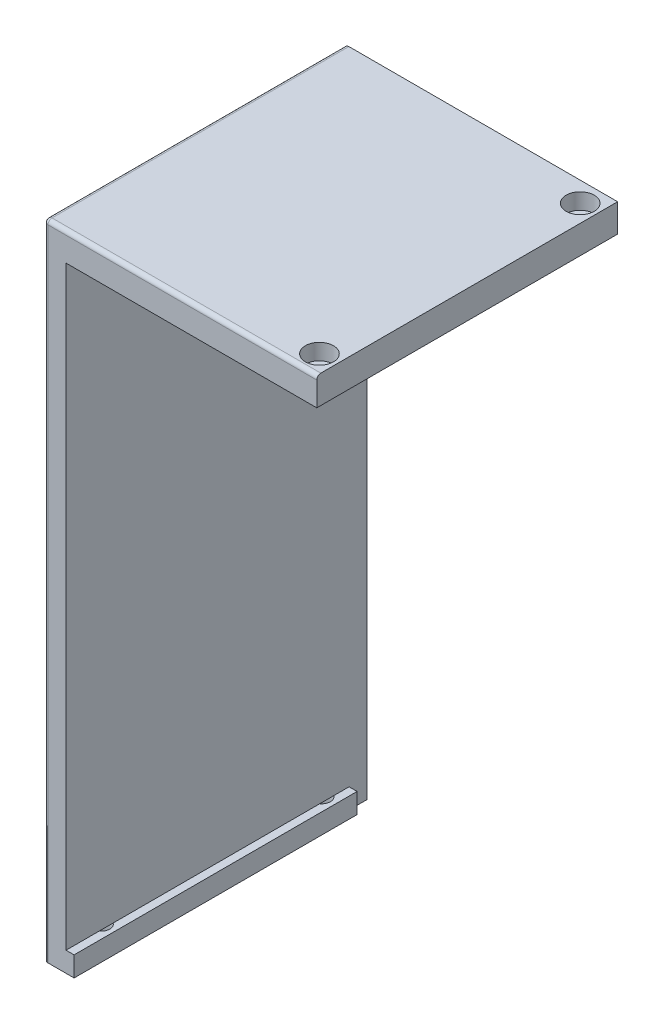
ISO-10303-21;
HEADER;
FILE_DESCRIPTION(('STEP AP214'),'2;1');
FILE_NAME('part.step','',(''),(''),'','','');
FILE_SCHEMA(('AUTOMOTIVE_DESIGN { 1 0 10303 214 1 1 1 1 }'));
ENDSEC;
DATA;
#1=APPLICATION_CONTEXT('core data for automotive mechanical design processes');
#2=APPLICATION_PROTOCOL_DEFINITION('international standard','automotive_design',2000,#1);
#3=PRODUCT_CONTEXT('',#1,'mechanical');
#4=PRODUCT('Part','Part','',(#3));
#5=PRODUCT_RELATED_PRODUCT_CATEGORY('part','',(#4));
#6=PRODUCT_DEFINITION_FORMATION('','',#4);
#7=PRODUCT_DEFINITION_CONTEXT('part definition',#1,'design');
#8=PRODUCT_DEFINITION('design','',#6,#7);
#9=PRODUCT_DEFINITION_SHAPE('','',#8);
#10=(LENGTH_UNIT() NAMED_UNIT(*) SI_UNIT(.MILLI.,.METRE.));
#11=(NAMED_UNIT(*) PLANE_ANGLE_UNIT() SI_UNIT($,.RADIAN.));
#12=(NAMED_UNIT(*) SI_UNIT($,.STERADIAN.) SOLID_ANGLE_UNIT());
#13=UNCERTAINTY_MEASURE_WITH_UNIT(LENGTH_MEASURE(1.E-05),#10,'distance_accuracy_value','');
#14=(GEOMETRIC_REPRESENTATION_CONTEXT(3) GLOBAL_UNCERTAINTY_ASSIGNED_CONTEXT((#13)) GLOBAL_UNIT_ASSIGNED_CONTEXT((#10,
#11,#12)) REPRESENTATION_CONTEXT('',''));
#15=CARTESIAN_POINT('',(0.,0.,0.));
#16=DIRECTION('',(0.,0.,1.));
#17=DIRECTION('',(1.,0.,0.));
#18=AXIS2_PLACEMENT_3D('',#15,#16,#17);
#19=CARTESIAN_POINT('',(-88.5,-160.346147871578,249.169133709891));
#20=DIRECTION('',(-1.,0.,0.));
#21=DIRECTION('',(0.,-1.,0.));
#22=AXIS2_PLACEMENT_3D('',#19,#20,#21);
#23=PLANE('',#22);
#24=DIRECTION('',(0.,1.,0.));
#25=VECTOR('',#24,1.);
#26=CARTESIAN_POINT('',(-88.5,-160.346147871578,4.44806923152896));
#27=LINE('',#26,#25);
#28=CARTESIAN_POINT('',(-88.5,-160.346147871578,4.44806923152896));
#29=VERTEX_POINT('',#28);
#30=CARTESIAN_POINT('',(-88.5,-155.346147871578,4.44806923152896));
#31=VERTEX_POINT('',#30);
#32=EDGE_CURVE('E177',#29,#31,#27,.T.);
#33=ORIENTED_EDGE('',*,*,#32,.F.);
#34=DIRECTION('',(0.,0.,-1.));
#35=VECTOR('',#34,1.);
#36=CARTESIAN_POINT('',(-88.5,-160.346147871578,249.169133709891));
#37=LINE('',#36,#35);
#38=CARTESIAN_POINT('',(-88.5,-160.346147871578,0.));
#39=VERTEX_POINT('',#38);
#40=EDGE_CURVE('E222',#29,#39,#37,.T.);
#41=ORIENTED_EDGE('',*,*,#40,.T.);
#42=DIRECTION('',(0.,1.,0.));
#43=VECTOR('',#42,1.);
#44=CARTESIAN_POINT('',(-88.5,-160.346147871578,0.));
#45=LINE('',#44,#43);
#46=CARTESIAN_POINT('',(-88.5,-7.00000000000011,0.));
#47=VERTEX_POINT('',#46);
#48=EDGE_CURVE('E233',#39,#47,#45,.T.);
#49=ORIENTED_EDGE('',*,*,#48,.T.);
#50=DIRECTION('',(0.,0.,-1.));
#51=VECTOR('',#50,1.);
#52=CARTESIAN_POINT('',(-88.5,-7.00000000000011,249.169133709891));
#53=LINE('',#52,#51);
#54=CARTESIAN_POINT('',(-88.5,-7.00000000000011,75.0000000000001));
#55=VERTEX_POINT('',#54);
#56=EDGE_CURVE('E264',#55,#47,#53,.T.);
#57=ORIENTED_EDGE('',*,*,#56,.F.);
#58=DIRECTION('',(0.,-1.,0.));
#59=VECTOR('',#58,1.);
#60=CARTESIAN_POINT('',(-88.5,-160.346147871578,75.0000000000001));
#61=LINE('',#60,#59);
#62=CARTESIAN_POINT('',(-88.5,-155.346147871578,75.0000000000001));
#63=VERTEX_POINT('',#62);
#64=EDGE_CURVE('E223',#55,#63,#61,.T.);
#65=ORIENTED_EDGE('',*,*,#64,.T.);
#66=DIRECTION('',(0.,0.,1.));
#67=VECTOR('',#66,1.);
#68=CARTESIAN_POINT('',(-88.5,-155.346147871578,75.0000000000001));
#69=LINE('',#68,#67);
#70=CARTESIAN_POINT('',(-88.5,-155.346147871578,66.7492855684538));
#71=VERTEX_POINT('',#70);
#72=EDGE_CURVE('E166',#71,#63,#69,.T.);
#73=ORIENTED_EDGE('',*,*,#72,.F.);
#74=CARTESIAN_POINT('',(-88.5,-155.346147871578,63.2507144315466));
#75=VERTEX_POINT('',#74);
#76=EDGE_CURVE('E158',#75,#71,#69,.T.);
#77=ORIENTED_EDGE('',*,*,#76,.F.);
#78=CARTESIAN_POINT('',(-88.5,-155.346147871578,11.7492855684538));
#79=VERTEX_POINT('',#78);
#80=EDGE_CURVE('E168',#79,#75,#69,.T.);
#81=ORIENTED_EDGE('',*,*,#80,.F.);
#82=CARTESIAN_POINT('',(-88.5,-155.346147871578,8.2507144315466));
#83=VERTEX_POINT('',#82);
#84=EDGE_CURVE('E173',#83,#79,#69,.T.);
#85=ORIENTED_EDGE('',*,*,#84,.F.);
#86=EDGE_CURVE('E174',#31,#83,#69,.T.);
#87=ORIENTED_EDGE('',*,*,#86,.F.);
#88=EDGE_LOOP('',(#33,#41,#49,#57,#65,#73,#77,#81,#85,#87));
#89=FACE_BOUND('',#88,.T.);
#90=ADVANCED_FACE('F44',(#89),#23,.F.);
#91=CARTESIAN_POINT('',(-30.3417133767425,-160.347147871578,70.0000000000001));
#92=DIRECTION('',(0.,1.,0.));
#93=DIRECTION('',(0.,0.,1.));
#94=AXIS2_PLACEMENT_3D('',#91,#92,#93);
#95=CYLINDRICAL_SURFACE('',#94,2.05);
#96=CARTESIAN_POINT('',(-30.3417133767425,-7.00000000000012,70.0000000000001));
#97=DIRECTION('',(0.,1.,0.));
#98=DIRECTION('',(-1.,0.,0.));
#99=AXIS2_PLACEMENT_3D('',#96,#97,#98);
#100=CIRCLE('',#99,2.05);
#101=CARTESIAN_POINT('',(-32.3917133767425,-7.00000000000012,70.0000000000001));
#102=VERTEX_POINT('',#101);
#103=EDGE_CURVE('E200',#102,#102,#100,.F.);
#104=ORIENTED_EDGE('',*,*,#103,.T.);
#105=EDGE_LOOP('',(#104));
#106=FACE_BOUND('',#105,.T.);
#107=CARTESIAN_POINT('',(-30.3417133767425,-4.,70.0000000000001));
#108=DIRECTION('',(0.,1.,0.));
#109=DIRECTION('',(0.,0.,1.));
#110=AXIS2_PLACEMENT_3D('',#107,#108,#109);
#111=CIRCLE('',#110,2.05);
#112=CARTESIAN_POINT('',(-30.3417133767425,-4.,72.0500000000001));
#113=VERTEX_POINT('',#112);
#114=EDGE_CURVE('E194',#113,#113,#111,.T.);
#115=ORIENTED_EDGE('',*,*,#114,.T.);
#116=EDGE_LOOP('',(#115));
#117=FACE_BOUND('',#116,.T.);
#118=ADVANCED_FACE('F375',(#106,#117),#95,.F.);
#119=CARTESIAN_POINT('',(-30.3417133767425,-160.347147871578,5.0000000000001));
#120=DIRECTION('',(0.,1.,0.));
#121=DIRECTION('',(0.,0.,1.));
#122=AXIS2_PLACEMENT_3D('',#119,#120,#121);
#123=CYLINDRICAL_SURFACE('',#122,2.05);
#124=CARTESIAN_POINT('',(-30.3417133767425,-7.00000000000012,5.0000000000001));
#125=DIRECTION('',(0.,1.,0.));
#126=DIRECTION('',(-1.,0.,0.));
#127=AXIS2_PLACEMENT_3D('',#124,#125,#126);
#128=CIRCLE('',#127,2.05);
#129=CARTESIAN_POINT('',(-32.3917133767425,-7.00000000000012,5.0000000000001));
#130=VERTEX_POINT('',#129);
#131=EDGE_CURVE('E214',#130,#130,#128,.F.);
#132=ORIENTED_EDGE('',*,*,#131,.T.);
#133=EDGE_LOOP('',(#132));
#134=FACE_BOUND('',#133,.T.);
#135=CARTESIAN_POINT('',(-30.3417133767425,-4.,5.0000000000001));
#136=DIRECTION('',(0.,1.,0.));
#137=DIRECTION('',(0.,0.,1.));
#138=AXIS2_PLACEMENT_3D('',#135,#136,#137);
#139=CIRCLE('',#138,2.05);
#140=CARTESIAN_POINT('',(-30.3417133767425,-4.,7.0500000000001));
#141=VERTEX_POINT('',#140);
#142=EDGE_CURVE('E191',#141,#141,#139,.T.);
#143=ORIENTED_EDGE('',*,*,#142,.T.);
#144=EDGE_LOOP('',(#143));
#145=FACE_BOUND('',#144,.T.);
#146=ADVANCED_FACE('F376',(#134,#145),#123,.F.);
#147=CARTESIAN_POINT('',(-93.,-1.00000000000022,0.));
#148=DIRECTION('',(0.,0.,1.));
#149=DIRECTION('',(1.,0.,0.));
#150=AXIS2_PLACEMENT_3D('',#147,#148,#149);
#151=PLANE('',#150);
#152=DIRECTION('',(1.,0.,0.));
#153=VECTOR('',#152,1.);
#154=CARTESIAN_POINT('',(-88.5,-160.346147871578,0.));
#155=LINE('',#154,#153);
#156=CARTESIAN_POINT('',(-94.,-160.346147871578,0.));
#157=VERTEX_POINT('',#156);
#158=EDGE_CURVE('E213',#157,#39,#155,.T.);
#159=ORIENTED_EDGE('',*,*,#158,.F.);
#160=DIRECTION('',(0.,-1.,0.));
#161=VECTOR('',#160,1.);
#162=CARTESIAN_POINT('',(-94.,-160.346147871578,0.));
#163=LINE('',#162,#161);
#164=CARTESIAN_POINT('',(-94.,-1.00000000000022,0.));
#165=VERTEX_POINT('',#164);
#166=EDGE_CURVE('E250',#165,#157,#163,.T.);
#167=ORIENTED_EDGE('',*,*,#166,.F.);
#168=CARTESIAN_POINT('',(-93.,-1.00000000000022,0.));
#169=DIRECTION('',(0.,0.,1.));
#170=DIRECTION('',(1.,0.,0.));
#171=AXIS2_PLACEMENT_3D('',#168,#169,#170);
#172=CIRCLE('',#171,1.);
#173=CARTESIAN_POINT('',(-93.,-2.2227497988864E-13,0.));
#174=VERTEX_POINT('',#173);
#175=EDGE_CURVE('E242',#174,#165,#172,.T.);
#176=ORIENTED_EDGE('',*,*,#175,.F.);
#177=DIRECTION('',(-1.,0.,0.));
#178=VECTOR('',#177,1.);
#179=CARTESIAN_POINT('',(-26.,-1.11252677426124E-13,0.));
#180=LINE('',#179,#178);
#181=CARTESIAN_POINT('',(-26.,-1.11252677426124E-13,0.));
#182=VERTEX_POINT('',#181);
#183=EDGE_CURVE('E241',#182,#174,#180,.T.);
#184=ORIENTED_EDGE('',*,*,#183,.F.);
#185=DIRECTION('',(0.,1.,0.));
#186=VECTOR('',#185,1.);
#187=CARTESIAN_POINT('',(-26.,-7.00000000000012,0.));
#188=LINE('',#187,#186);
#189=CARTESIAN_POINT('',(-26.,-7.00000000000012,0.));
#190=VERTEX_POINT('',#189);
#191=EDGE_CURVE('E238',#190,#182,#188,.T.);
#192=ORIENTED_EDGE('',*,*,#191,.F.);
#193=DIRECTION('',(1.,0.,0.));
#194=VECTOR('',#193,1.);
#195=CARTESIAN_POINT('',(-88.5,-7.00000000000011,0.));
#196=LINE('',#195,#194);
#197=EDGE_CURVE('E232',#47,#190,#196,.T.);
#198=ORIENTED_EDGE('',*,*,#197,.F.);
#199=ORIENTED_EDGE('',*,*,#48,.F.);
#200=EDGE_LOOP('',(#159,#167,#176,#184,#192,#198,#199));
#201=FACE_BOUND('',#200,.T.);
#202=ADVANCED_FACE('F345',(#201),#151,.F.);
#203=CARTESIAN_POINT('',(-94.,-160.346147871578,249.169133709891));
#204=DIRECTION('',(1.,0.,0.));
#205=DIRECTION('',(0.,0.,-1.));
#206=AXIS2_PLACEMENT_3D('',#203,#204,#205);
#207=PLANE('',#206);
#208=DIRECTION('',(0.,0.,-1.));
#209=VECTOR('',#208,1.);
#210=CARTESIAN_POINT('',(-94.,-160.346147871578,249.169133709891));
#211=LINE('',#210,#209);
#212=CARTESIAN_POINT('',(-94.,-160.346147871578,74.0000000000001));
#213=VERTEX_POINT('',#212);
#214=EDGE_CURVE('E252',#213,#157,#211,.T.);
#215=ORIENTED_EDGE('',*,*,#214,.F.);
#216=DIRECTION('',(0.,1.,0.));
#217=VECTOR('',#216,1.);
#218=CARTESIAN_POINT('',(-94.,-160.346147871578,74.0000000000001));
#219=LINE('',#218,#217);
#220=CARTESIAN_POINT('',(-94.,-1.00000000000022,74.0000000000001));
#221=VERTEX_POINT('',#220);
#222=EDGE_CURVE('E53',#213,#221,#219,.T.);
#223=ORIENTED_EDGE('',*,*,#222,.T.);
#224=DIRECTION('',(0.,0.,-1.));
#225=VECTOR('',#224,1.);
#226=CARTESIAN_POINT('',(-94.,-1.00000000000022,249.169133709891));
#227=LINE('',#226,#225);
#228=EDGE_CURVE('E254',#221,#165,#227,.T.);
#229=ORIENTED_EDGE('',*,*,#228,.T.);
#230=ORIENTED_EDGE('',*,*,#166,.T.);
#231=EDGE_LOOP('',(#215,#223,#229,#230));
#232=FACE_BOUND('',#231,.T.);
#233=ADVANCED_FACE('F338',(#232),#207,.F.);
#234=CARTESIAN_POINT('',(-93.,-1.00000000000022,249.169133709891));
#235=DIRECTION('',(0.,0.,-1.));
#236=DIRECTION('',(-1.,0.,0.));
#237=AXIS2_PLACEMENT_3D('',#234,#235,#236);
#238=CYLINDRICAL_SURFACE('',#237,1.);
#239=ORIENTED_EDGE('',*,*,#228,.F.);
#240=CARTESIAN_POINT('',(-93.,-1.00000000000022,74.0000000000001));
#241=DIRECTION('',(0.,0.,-1.));
#242=DIRECTION('',(-1.,0.,0.));
#243=AXIS2_PLACEMENT_3D('',#240,#241,#242);
#244=CIRCLE('',#243,1.);
#245=CARTESIAN_POINT('',(-93.,-2.2227497988864E-13,74.0000000000001));
#246=VERTEX_POINT('',#245);
#247=EDGE_CURVE('E277',#221,#246,#244,.T.);
#248=ORIENTED_EDGE('',*,*,#247,.T.);
#249=DIRECTION('',(0.,0.,-1.));
#250=VECTOR('',#249,1.);
#251=CARTESIAN_POINT('',(-93.,-2.2227497988864E-13,249.169133709891));
#252=LINE('',#251,#250);
#253=EDGE_CURVE('E253',#246,#174,#252,.T.);
#254=ORIENTED_EDGE('',*,*,#253,.T.);
#255=ORIENTED_EDGE('',*,*,#175,.T.);
#256=EDGE_LOOP('',(#239,#248,#254,#255));
#257=FACE_BOUND('',#256,.T.);
#258=ADVANCED_FACE('F336',(#257),#238,.T.);
#259=CARTESIAN_POINT('',(-26.,-1.11252677426124E-13,249.169133709891));
#260=DIRECTION('',(0.,-1.,0.));
#261=DIRECTION('',(1.,0.,0.));
#262=AXIS2_PLACEMENT_3D('',#259,#260,#261);
#263=PLANE('',#262);
#264=CARTESIAN_POINT('',(-30.3417133767425,0.,5.0000000000001));
#265=DIRECTION('',(0.,1.,0.));
#266=DIRECTION('',(0.,0.,1.));
#267=AXIS2_PLACEMENT_3D('',#264,#265,#266);
#268=CIRCLE('',#267,3.5);
#269=CARTESIAN_POINT('',(-30.3417133767425,0.,8.5000000000001));
#270=VERTEX_POINT('',#269);
#271=EDGE_CURVE('E192',#270,#270,#268,.T.);
#272=ORIENTED_EDGE('',*,*,#271,.F.);
#273=EDGE_LOOP('',(#272));
#274=FACE_BOUND('',#273,.T.);
#275=CARTESIAN_POINT('',(-30.3417133767425,0.,70.0000000000001));
#276=DIRECTION('',(0.,1.,0.));
#277=DIRECTION('',(0.,0.,1.));
#278=AXIS2_PLACEMENT_3D('',#275,#276,#277);
#279=CIRCLE('',#278,3.5);
#280=CARTESIAN_POINT('',(-30.3417133767425,0.,73.5000000000001));
#281=VERTEX_POINT('',#280);
#282=EDGE_CURVE('E203',#281,#281,#279,.T.);
#283=ORIENTED_EDGE('',*,*,#282,.F.);
#284=EDGE_LOOP('',(#283));
#285=FACE_BOUND('',#284,.T.);
#286=ORIENTED_EDGE('',*,*,#253,.F.);
#287=DIRECTION('',(1.,0.,0.));
#288=VECTOR('',#287,1.);
#289=CARTESIAN_POINT('',(-26.,-1.11252677426124E-13,74.0000000000001));
#290=LINE('',#289,#288);
#291=CARTESIAN_POINT('',(-26.,-1.11252677426124E-13,74.0000000000001));
#292=VERTEX_POINT('',#291);
#293=EDGE_CURVE('E270',#246,#292,#290,.T.);
#294=ORIENTED_EDGE('',*,*,#293,.T.);
#295=DIRECTION('',(0.,0.,-1.));
#296=VECTOR('',#295,1.);
#297=CARTESIAN_POINT('',(-26.,-1.11252677426124E-13,249.169133709891));
#298=LINE('',#297,#296);
#299=EDGE_CURVE('E256',#292,#182,#298,.T.);
#300=ORIENTED_EDGE('',*,*,#299,.T.);
#301=ORIENTED_EDGE('',*,*,#183,.T.);
#302=EDGE_LOOP('',(#286,#294,#300,#301));
#303=FACE_BOUND('',#302,.T.);
#304=ADVANCED_FACE('F333',(#274,#285,#303),#263,.F.);
#305=CARTESIAN_POINT('',(-26.,-7.00000000000012,249.169133709891));
#306=DIRECTION('',(-1.,0.,0.));
#307=DIRECTION('',(0.,0.,1.));
#308=AXIS2_PLACEMENT_3D('',#305,#306,#307);
#309=PLANE('',#308);
#310=ORIENTED_EDGE('',*,*,#299,.F.);
#311=CARTESIAN_POINT('',(-26.,-1.00000000000011,74.0000000000001));
#312=DIRECTION('',(-1.,0.,0.));
#313=DIRECTION('',(0.,0.,1.));
#314=AXIS2_PLACEMENT_3D('',#311,#312,#313);
#315=CIRCLE('',#314,1.);
#316=CARTESIAN_POINT('',(-26.,-1.00000000000011,75.0000000000001));
#317=VERTEX_POINT('',#316);
#318=EDGE_CURVE('E272',#292,#317,#315,.F.);
#319=ORIENTED_EDGE('',*,*,#318,.T.);
#320=DIRECTION('',(0.,-1.,0.));
#321=VECTOR('',#320,1.);
#322=CARTESIAN_POINT('',(-26.,-7.00000000000011,75.0000000000001));
#323=LINE('',#322,#321);
#324=CARTESIAN_POINT('',(-26.,-7.00000000000012,75.0000000000001));
#325=VERTEX_POINT('',#324);
#326=EDGE_CURVE('E217',#317,#325,#323,.T.);
#327=ORIENTED_EDGE('',*,*,#326,.T.);
#328=DIRECTION('',(0.,0.,-1.));
#329=VECTOR('',#328,1.);
#330=CARTESIAN_POINT('',(-26.,-7.00000000000012,249.169133709891));
#331=LINE('',#330,#329);
#332=EDGE_CURVE('E257',#325,#190,#331,.T.);
#333=ORIENTED_EDGE('',*,*,#332,.T.);
#334=ORIENTED_EDGE('',*,*,#191,.T.);
#335=EDGE_LOOP('',(#310,#319,#327,#333,#334));
#336=FACE_BOUND('',#335,.T.);
#337=ADVANCED_FACE('F330',(#336),#309,.F.);
#338=CARTESIAN_POINT('',(-88.5,-7.00000000000011,249.169133709891));
#339=DIRECTION('',(0.,1.,0.));
#340=DIRECTION('',(-1.,0.,0.));
#341=AXIS2_PLACEMENT_3D('',#338,#339,#340);
#342=PLANE('',#341);
#343=ORIENTED_EDGE('',*,*,#131,.F.);
#344=EDGE_LOOP('',(#343));
#345=FACE_BOUND('',#344,.T.);
#346=ORIENTED_EDGE('',*,*,#103,.F.);
#347=EDGE_LOOP('',(#346));
#348=FACE_BOUND('',#347,.T.);
#349=ORIENTED_EDGE('',*,*,#332,.F.);
#350=DIRECTION('',(-1.,0.,0.));
#351=VECTOR('',#350,1.);
#352=CARTESIAN_POINT('',(-88.5,-7.00000000000011,75.0000000000001));
#353=LINE('',#352,#351);
#354=EDGE_CURVE('E220',#325,#55,#353,.T.);
#355=ORIENTED_EDGE('',*,*,#354,.T.);
#356=ORIENTED_EDGE('',*,*,#56,.T.);
#357=ORIENTED_EDGE('',*,*,#197,.T.);
#358=EDGE_LOOP('',(#349,#355,#356,#357));
#359=FACE_BOUND('',#358,.T.);
#360=ADVANCED_FACE('F326',(#345,#348,#359),#342,.F.);
#361=CARTESIAN_POINT('',(-88.5,-160.346147871578,249.169133709891));
#362=DIRECTION('',(0.,1.,0.));
#363=DIRECTION('',(0.,0.,1.));
#364=AXIS2_PLACEMENT_3D('',#361,#362,#363);
#365=PLANE('',#364);
#366=CARTESIAN_POINT('',(-89.75,-160.346147871578,10.0000000000002));
#367=DIRECTION('',(0.,-1.,0.));
#368=DIRECTION('',(0.,0.,-1.));
#369=AXIS2_PLACEMENT_3D('',#366,#367,#368);
#370=CIRCLE('',#369,2.15);
#371=CARTESIAN_POINT('',(-89.75,-160.346147871578,7.85000000000018));
#372=VERTEX_POINT('',#371);
#373=EDGE_CURVE('E342',#372,#372,#370,.T.);
#374=ORIENTED_EDGE('',*,*,#373,.F.);
#375=EDGE_LOOP('',(#374));
#376=FACE_BOUND('',#375,.T.);
#377=CARTESIAN_POINT('',(-89.75,-160.346147871578,65.0000000000002));
#378=DIRECTION('',(0.,-1.,0.));
#379=DIRECTION('',(0.,0.,-1.));
#380=AXIS2_PLACEMENT_3D('',#377,#378,#379);
#381=CIRCLE('',#380,2.15);
#382=CARTESIAN_POINT('',(-89.75,-160.346147871578,62.8500000000002));
#383=VERTEX_POINT('',#382);
#384=EDGE_CURVE('E163',#383,#383,#381,.T.);
#385=ORIENTED_EDGE('',*,*,#384,.F.);
#386=EDGE_LOOP('',(#385));
#387=FACE_BOUND('',#386,.T.);
#388=DIRECTION('',(-1.,0.,0.));
#389=VECTOR('',#388,1.);
#390=CARTESIAN_POINT('',(-88.5,-160.346147871578,75.0000000000001));
#391=LINE('',#390,#389);
#392=CARTESIAN_POINT('',(-86.5,-160.346147871578,75.0000000000001));
#393=VERTEX_POINT('',#392);
#394=CARTESIAN_POINT('',(-93.,-160.346147871578,75.0000000000001));
#395=VERTEX_POINT('',#394);
#396=EDGE_CURVE('E155',#393,#395,#391,.T.);
#397=ORIENTED_EDGE('',*,*,#396,.T.);
#398=CARTESIAN_POINT('',(-93.,-160.346147871578,74.0000000000001));
#399=DIRECTION('',(0.,1.,0.));
#400=DIRECTION('',(0.,0.,1.));
#401=AXIS2_PLACEMENT_3D('',#398,#399,#400);
#402=CIRCLE('',#401,1.);
#403=EDGE_CURVE('E11',#395,#213,#402,.F.);
#404=ORIENTED_EDGE('',*,*,#403,.T.);
#405=ORIENTED_EDGE('',*,*,#214,.T.);
#406=ORIENTED_EDGE('',*,*,#158,.T.);
#407=ORIENTED_EDGE('',*,*,#40,.F.);
#408=DIRECTION('',(-1.,0.,0.));
#409=VECTOR('',#408,1.);
#410=CARTESIAN_POINT('',(-86.5,-160.346147871578,4.44806923152896));
#411=LINE('',#410,#409);
#412=CARTESIAN_POINT('',(-86.5,-160.346147871578,4.44806923152896));
#413=VERTEX_POINT('',#412);
#414=EDGE_CURVE('E189',#413,#29,#411,.T.);
#415=ORIENTED_EDGE('',*,*,#414,.F.);
#416=DIRECTION('',(0.,0.,-1.));
#417=VECTOR('',#416,1.);
#418=CARTESIAN_POINT('',(-86.5,-160.346147871578,75.0000000000001));
#419=LINE('',#418,#417);
#420=EDGE_CURVE('E303',#393,#413,#419,.T.);
#421=ORIENTED_EDGE('',*,*,#420,.F.);
#422=EDGE_LOOP('',(#397,#404,#405,#406,#407,#415,#421));
#423=FACE_BOUND('',#422,.T.);
#424=ADVANCED_FACE('F301',(#376,#387,#423),#365,.F.);
#425=CARTESIAN_POINT('',(-26.,-284.465111250859,75.0000000000001));
#426=DIRECTION('',(0.,0.,-1.));
#427=DIRECTION('',(0.,-1.,0.));
#428=AXIS2_PLACEMENT_3D('',#425,#426,#427);
#429=PLANE('',#428);
#430=ORIENTED_EDGE('',*,*,#326,.F.);
#431=DIRECTION('',(1.,0.,0.));
#432=VECTOR('',#431,1.);
#433=CARTESIAN_POINT('',(-26.0000000000005,-1.00000000000011,75.0000000000001));
#434=LINE('',#433,#432);
#435=CARTESIAN_POINT('',(-93.,-1.00000000000022,75.0000000000001));
#436=VERTEX_POINT('',#435);
#437=EDGE_CURVE('E276',#317,#436,#434,.F.);
#438=ORIENTED_EDGE('',*,*,#437,.T.);
#439=DIRECTION('',(0.,1.,0.));
#440=VECTOR('',#439,1.);
#441=CARTESIAN_POINT('',(-93.,-284.465111250859,75.0000000000001));
#442=LINE('',#441,#440);
#443=EDGE_CURVE('E274',#436,#395,#442,.F.);
#444=ORIENTED_EDGE('',*,*,#443,.T.);
#445=ORIENTED_EDGE('',*,*,#396,.F.);
#446=DIRECTION('',(0.,-1.,0.));
#447=VECTOR('',#446,1.);
#448=CARTESIAN_POINT('',(-86.5,-160.346147871578,75.0000000000001));
#449=LINE('',#448,#447);
#450=CARTESIAN_POINT('',(-86.5,-155.346147871578,75.0000000000001));
#451=VERTEX_POINT('',#450);
#452=EDGE_CURVE('E178',#451,#393,#449,.T.);
#453=ORIENTED_EDGE('',*,*,#452,.F.);
#454=DIRECTION('',(-1.,0.,0.));
#455=VECTOR('',#454,1.);
#456=CARTESIAN_POINT('',(-86.5,-155.346147871578,75.0000000000001));
#457=LINE('',#456,#455);
#458=EDGE_CURVE('E181',#451,#63,#457,.T.);
#459=ORIENTED_EDGE('',*,*,#458,.T.);
#460=ORIENTED_EDGE('',*,*,#64,.F.);
#461=ORIENTED_EDGE('',*,*,#354,.F.);
#462=EDGE_LOOP('',(#430,#438,#444,#445,#453,#459,#460,#461));
#463=FACE_BOUND('',#462,.T.);
#464=ADVANCED_FACE('F296',(#463),#429,.F.);
#465=CARTESIAN_POINT('',(-30.3417133767425,-4.,5.0000000000001));
#466=DIRECTION('',(0.,1.,0.));
#467=DIRECTION('',(0.,0.,1.));
#468=AXIS2_PLACEMENT_3D('',#465,#466,#467);
#469=CYLINDRICAL_SURFACE('',#468,3.5);
#470=CARTESIAN_POINT('',(-30.3417133767425,-4.,5.0000000000001));
#471=DIRECTION('',(0.,1.,0.));
#472=DIRECTION('',(0.,0.,1.));
#473=AXIS2_PLACEMENT_3D('',#470,#471,#472);
#474=CIRCLE('',#473,3.5);
#475=CARTESIAN_POINT('',(-30.3417133767425,-4.,8.5000000000001));
#476=VERTEX_POINT('',#475);
#477=EDGE_CURVE('E197',#476,#476,#474,.T.);
#478=ORIENTED_EDGE('',*,*,#477,.F.);
#479=EDGE_LOOP('',(#478));
#480=FACE_BOUND('',#479,.T.);
#481=ORIENTED_EDGE('',*,*,#271,.T.);
#482=EDGE_LOOP('',(#481));
#483=FACE_BOUND('',#482,.T.);
#484=ADVANCED_FACE('F364',(#480,#483),#469,.F.);
#485=CARTESIAN_POINT('',(-30.3417133767425,-4.,5.0000000000001));
#486=DIRECTION('',(0.,1.,0.));
#487=DIRECTION('',(0.,0.,1.));
#488=AXIS2_PLACEMENT_3D('',#485,#486,#487);
#489=PLANE('',#488);
#490=ORIENTED_EDGE('',*,*,#142,.F.);
#491=EDGE_LOOP('',(#490));
#492=FACE_BOUND('',#491,.T.);
#493=ORIENTED_EDGE('',*,*,#477,.T.);
#494=EDGE_LOOP('',(#493));
#495=FACE_BOUND('',#494,.T.);
#496=ADVANCED_FACE('F397',(#492,#495),#489,.T.);
#497=CARTESIAN_POINT('',(-30.3417133767425,-4.,70.0000000000001));
#498=DIRECTION('',(0.,1.,0.));
#499=DIRECTION('',(0.,0.,1.));
#500=AXIS2_PLACEMENT_3D('',#497,#498,#499);
#501=CYLINDRICAL_SURFACE('',#500,3.5);
#502=CARTESIAN_POINT('',(-30.3417133767425,-4.,70.0000000000001));
#503=DIRECTION('',(0.,1.,0.));
#504=DIRECTION('',(0.,0.,1.));
#505=AXIS2_PLACEMENT_3D('',#502,#503,#504);
#506=CIRCLE('',#505,3.5);
#507=CARTESIAN_POINT('',(-30.3417133767425,-4.,73.5000000000001));
#508=VERTEX_POINT('',#507);
#509=EDGE_CURVE('E196',#508,#508,#506,.T.);
#510=ORIENTED_EDGE('',*,*,#509,.F.);
#511=EDGE_LOOP('',(#510));
#512=FACE_BOUND('',#511,.T.);
#513=ORIENTED_EDGE('',*,*,#282,.T.);
#514=EDGE_LOOP('',(#513));
#515=FACE_BOUND('',#514,.T.);
#516=ADVANCED_FACE('F392',(#512,#515),#501,.F.);
#517=CARTESIAN_POINT('',(-30.3417133767425,-4.,70.0000000000001));
#518=DIRECTION('',(0.,1.,0.));
#519=DIRECTION('',(0.,0.,1.));
#520=AXIS2_PLACEMENT_3D('',#517,#518,#519);
#521=PLANE('',#520);
#522=ORIENTED_EDGE('',*,*,#114,.F.);
#523=EDGE_LOOP('',(#522));
#524=FACE_BOUND('',#523,.T.);
#525=ORIENTED_EDGE('',*,*,#509,.T.);
#526=EDGE_LOOP('',(#525));
#527=FACE_BOUND('',#526,.T.);
#528=ADVANCED_FACE('F395',(#524,#527),#521,.T.);
#529=CARTESIAN_POINT('',(-86.5,-160.346147871578,4.44806923152896));
#530=DIRECTION('',(0.,0.,1.));
#531=DIRECTION('',(1.,0.,0.));
#532=AXIS2_PLACEMENT_3D('',#529,#530,#531);
#533=PLANE('',#532);
#534=ORIENTED_EDGE('',*,*,#32,.T.);
#535=DIRECTION('',(-1.,0.,0.));
#536=VECTOR('',#535,1.);
#537=CARTESIAN_POINT('',(-86.5,-155.346147871578,4.44806923152896));
#538=LINE('',#537,#536);
#539=CARTESIAN_POINT('',(-86.5,-155.346147871578,4.44806923152896));
#540=VERTEX_POINT('',#539);
#541=EDGE_CURVE('E183',#540,#31,#538,.T.);
#542=ORIENTED_EDGE('',*,*,#541,.F.);
#543=DIRECTION('',(0.,1.,0.));
#544=VECTOR('',#543,1.);
#545=CARTESIAN_POINT('',(-86.5,-160.346147871578,4.44806923152896));
#546=LINE('',#545,#544);
#547=EDGE_CURVE('E308',#413,#540,#546,.T.);
#548=ORIENTED_EDGE('',*,*,#547,.F.);
#549=ORIENTED_EDGE('',*,*,#414,.T.);
#550=EDGE_LOOP('',(#534,#542,#548,#549));
#551=FACE_BOUND('',#550,.T.);
#552=ADVANCED_FACE('F316',(#551),#533,.F.);
#553=CARTESIAN_POINT('',(-86.5,-155.346147871578,75.0000000000001));
#554=DIRECTION('',(0.,-1.,0.));
#555=DIRECTION('',(1.,0.,0.));
#556=AXIS2_PLACEMENT_3D('',#553,#554,#555);
#557=PLANE('',#556);
#558=ORIENTED_EDGE('',*,*,#86,.T.);
#559=CARTESIAN_POINT('',(-89.75,-155.346147871578,10.0000000000002));
#560=DIRECTION('',(0.,-1.,0.));
#561=DIRECTION('',(1.,0.,0.));
#562=AXIS2_PLACEMENT_3D('',#559,#560,#561);
#563=CIRCLE('',#562,2.15);
#564=EDGE_CURVE('E153',#83,#79,#563,.T.);
#565=ORIENTED_EDGE('',*,*,#564,.T.);
#566=ORIENTED_EDGE('',*,*,#80,.T.);
#567=CARTESIAN_POINT('',(-89.75,-155.346147871578,65.0000000000002));
#568=DIRECTION('',(0.,-1.,0.));
#569=DIRECTION('',(1.,0.,0.));
#570=AXIS2_PLACEMENT_3D('',#567,#568,#569);
#571=CIRCLE('',#570,2.15);
#572=EDGE_CURVE('E143',#75,#71,#571,.T.);
#573=ORIENTED_EDGE('',*,*,#572,.T.);
#574=ORIENTED_EDGE('',*,*,#72,.T.);
#575=ORIENTED_EDGE('',*,*,#458,.F.);
#576=DIRECTION('',(0.,0.,1.));
#577=VECTOR('',#576,1.);
#578=CARTESIAN_POINT('',(-86.5,-155.346147871578,75.0000000000001));
#579=LINE('',#578,#577);
#580=EDGE_CURVE('E184',#540,#451,#579,.T.);
#581=ORIENTED_EDGE('',*,*,#580,.F.);
#582=ORIENTED_EDGE('',*,*,#541,.T.);
#583=EDGE_LOOP('',(#558,#565,#566,#573,#574,#575,#581,#582));
#584=FACE_BOUND('',#583,.T.);
#585=ADVANCED_FACE('F175',(#584),#557,.F.);
#586=CARTESIAN_POINT('',(-86.5,0.,0.));
#587=DIRECTION('',(-1.,0.,0.));
#588=DIRECTION('',(0.,0.,1.));
#589=AXIS2_PLACEMENT_3D('',#586,#587,#588);
#590=PLANE('',#589);
#591=ORIENTED_EDGE('',*,*,#452,.T.);
#592=ORIENTED_EDGE('',*,*,#420,.T.);
#593=ORIENTED_EDGE('',*,*,#547,.T.);
#594=ORIENTED_EDGE('',*,*,#580,.T.);
#595=EDGE_LOOP('',(#591,#592,#593,#594));
#596=FACE_BOUND('',#595,.T.);
#597=ADVANCED_FACE('F309',(#596),#590,.F.);
#598=CARTESIAN_POINT('',(-86.5,-155.346147871578,75.0000000000001));
#599=DIRECTION('',(0.,-1.,0.));
#600=DIRECTION('',(1.,0.,0.));
#601=AXIS2_PLACEMENT_3D('',#598,#599,#600);
#602=PLANE('',#601);
#603=ORIENTED_EDGE('',*,*,#76,.T.);
#604=CARTESIAN_POINT('',(-89.75,-155.346147871578,65.0000000000002));
#605=DIRECTION('',(0.,-1.,0.));
#606=DIRECTION('',(1.,0.,0.));
#607=AXIS2_PLACEMENT_3D('',#604,#605,#606);
#608=CIRCLE('',#607,2.15);
#609=EDGE_CURVE('E148',#75,#71,#608,.F.);
#610=ORIENTED_EDGE('',*,*,#609,.F.);
#611=EDGE_LOOP('',(#603,#610));
#612=FACE_BOUND('',#611,.T.);
#613=ADVANCED_FACE('F156',(#612),#602,.T.);
#614=CARTESIAN_POINT('',(-89.75,-149.265029553373,65.0000000000002));
#615=DIRECTION('',(0.,-1.,0.));
#616=DIRECTION('',(0.,0.,-1.));
#617=AXIS2_PLACEMENT_3D('',#614,#615,#616);
#618=CYLINDRICAL_SURFACE('',#617,2.15);
#619=ORIENTED_EDGE('',*,*,#609,.T.);
#620=ORIENTED_EDGE('',*,*,#572,.F.);
#621=EDGE_LOOP('',(#619,#620));
#622=FACE_BOUND('',#621,.T.);
#623=ORIENTED_EDGE('',*,*,#384,.T.);
#624=EDGE_LOOP('',(#623));
#625=FACE_BOUND('',#624,.T.);
#626=ADVANCED_FACE('F146',(#622,#625),#618,.F.);
#627=CARTESIAN_POINT('',(-86.5,-155.346147871578,75.0000000000001));
#628=DIRECTION('',(0.,-1.,0.));
#629=DIRECTION('',(1.,0.,0.));
#630=AXIS2_PLACEMENT_3D('',#627,#628,#629);
#631=PLANE('',#630);
#632=ORIENTED_EDGE('',*,*,#84,.T.);
#633=CARTESIAN_POINT('',(-89.75,-155.346147871578,10.0000000000002));
#634=DIRECTION('',(0.,-1.,0.));
#635=DIRECTION('',(1.,0.,0.));
#636=AXIS2_PLACEMENT_3D('',#633,#634,#635);
#637=CIRCLE('',#636,2.15);
#638=EDGE_CURVE('E343',#83,#79,#637,.F.);
#639=ORIENTED_EDGE('',*,*,#638,.F.);
#640=EDGE_LOOP('',(#632,#639));
#641=FACE_BOUND('',#640,.T.);
#642=ADVANCED_FACE('F420',(#641),#631,.T.);
#643=CARTESIAN_POINT('',(-89.75,-149.265029553373,10.0000000000002));
#644=DIRECTION('',(0.,-1.,0.));
#645=DIRECTION('',(0.,0.,-1.));
#646=AXIS2_PLACEMENT_3D('',#643,#644,#645);
#647=CYLINDRICAL_SURFACE('',#646,2.15);
#648=ORIENTED_EDGE('',*,*,#638,.T.);
#649=ORIENTED_EDGE('',*,*,#564,.F.);
#650=EDGE_LOOP('',(#648,#649));
#651=FACE_BOUND('',#650,.T.);
#652=ORIENTED_EDGE('',*,*,#373,.T.);
#653=EDGE_LOOP('',(#652));
#654=FACE_BOUND('',#653,.T.);
#655=ADVANCED_FACE('F419',(#651,#654),#647,.F.);
#656=CARTESIAN_POINT('',(-93.,-160.346147871578,74.0000000000001));
#657=DIRECTION('',(0.,1.,0.));
#658=DIRECTION('',(0.,0.,1.));
#659=AXIS2_PLACEMENT_3D('',#656,#657,#658);
#660=CYLINDRICAL_SURFACE('',#659,1.);
#661=CARTESIAN_POINT('',(-93.,-1.00000000000022,74.0000000000001));
#662=DIRECTION('',(0.,1.,0.));
#663=DIRECTION('',(0.,0.,1.));
#664=AXIS2_PLACEMENT_3D('',#661,#662,#663);
#665=CIRCLE('',#664,1.);
#666=EDGE_CURVE('E47',#221,#436,#665,.T.);
#667=ORIENTED_EDGE('',*,*,#666,.F.);
#668=ORIENTED_EDGE('',*,*,#222,.F.);
#669=ORIENTED_EDGE('',*,*,#403,.F.);
#670=ORIENTED_EDGE('',*,*,#443,.F.);
#671=EDGE_LOOP('',(#667,#668,#669,#670));
#672=FACE_BOUND('',#671,.T.);
#673=ADVANCED_FACE('F50',(#672),#660,.T.);
#674=CARTESIAN_POINT('',(-93.,-1.00000000000022,74.0000000000001));
#675=DIRECTION('',(0.,0.,-1.));
#676=DIRECTION('',(-1.,0.,0.));
#677=AXIS2_PLACEMENT_3D('',#674,#675,#676);
#678=SPHERICAL_SURFACE('',#677,1.);
#679=ORIENTED_EDGE('',*,*,#247,.F.);
#680=ORIENTED_EDGE('',*,*,#666,.T.);
#681=CARTESIAN_POINT('',(-93.,-1.00000000000022,74.0000000000001));
#682=DIRECTION('',(1.,0.,0.));
#683=DIRECTION('',(0.,0.,-1.));
#684=AXIS2_PLACEMENT_3D('',#681,#682,#683);
#685=CIRCLE('',#684,1.);
#686=EDGE_CURVE('E284',#246,#436,#685,.T.);
#687=ORIENTED_EDGE('',*,*,#686,.F.);
#688=EDGE_LOOP('',(#679,#680,#687));
#689=FACE_BOUND('',#688,.T.);
#690=ADVANCED_FACE('F291',(#689),#678,.T.);
#691=CARTESIAN_POINT('',(-26.,-1.00000000000011,74.0000000000001));
#692=DIRECTION('',(1.,0.,0.));
#693=DIRECTION('',(0.,1.,0.));
#694=AXIS2_PLACEMENT_3D('',#691,#692,#693);
#695=CYLINDRICAL_SURFACE('',#694,1.);
#696=ORIENTED_EDGE('',*,*,#686,.T.);
#697=ORIENTED_EDGE('',*,*,#437,.F.);
#698=ORIENTED_EDGE('',*,*,#318,.F.);
#699=ORIENTED_EDGE('',*,*,#293,.F.);
#700=EDGE_LOOP('',(#696,#697,#698,#699));
#701=FACE_BOUND('',#700,.T.);
#702=ADVANCED_FACE('F335',(#701),#695,.T.);
#703=CLOSED_SHELL('',(#90,#118,#146,#202,#233,#258,#304,#337,#360,#424,#464,#484,#496,#516,#528,
#552,#585,#597,#613,#626,#642,#655,#673,#690,#702));
#704=MANIFOLD_SOLID_BREP('B2',#703);
#705=ADVANCED_BREP_SHAPE_REPRESENTATION('',(#18,#704),#14);
#706=SHAPE_DEFINITION_REPRESENTATION(#9,#705);
ENDSEC;
END-ISO-10303-21;
